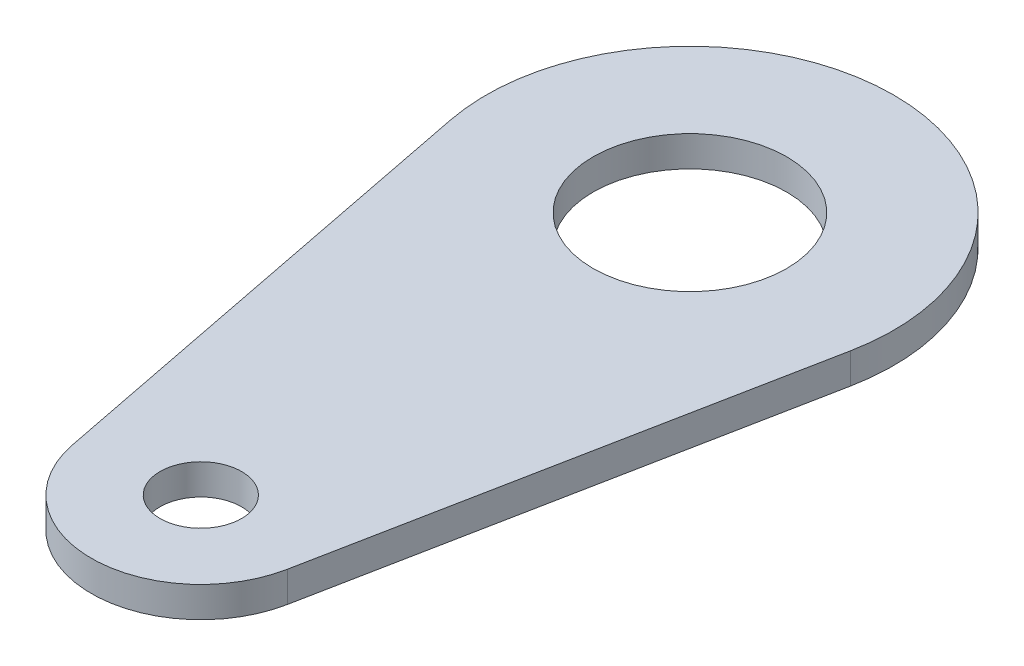
ISO-10303-21;
HEADER;
FILE_DESCRIPTION(('STEP AP214'),'2;1');
FILE_NAME('part.step','',(''),(''),'','','');
FILE_SCHEMA(('AUTOMOTIVE_DESIGN { 1 0 10303 214 1 1 1 1 }'));
ENDSEC;
DATA;
#1=APPLICATION_CONTEXT('core data for automotive mechanical design processes');
#2=APPLICATION_PROTOCOL_DEFINITION('international standard','automotive_design',2000,#1);
#3=PRODUCT_CONTEXT('',#1,'mechanical');
#4=PRODUCT('Part','Part','',(#3));
#5=PRODUCT_RELATED_PRODUCT_CATEGORY('part','',(#4));
#6=PRODUCT_DEFINITION_FORMATION('','',#4);
#7=PRODUCT_DEFINITION_CONTEXT('part definition',#1,'design');
#8=PRODUCT_DEFINITION('design','',#6,#7);
#9=PRODUCT_DEFINITION_SHAPE('','',#8);
#10=(LENGTH_UNIT() NAMED_UNIT(*) SI_UNIT(.MILLI.,.METRE.));
#11=(NAMED_UNIT(*) PLANE_ANGLE_UNIT() SI_UNIT($,.RADIAN.));
#12=(NAMED_UNIT(*) SI_UNIT($,.STERADIAN.) SOLID_ANGLE_UNIT());
#13=UNCERTAINTY_MEASURE_WITH_UNIT(LENGTH_MEASURE(1.E-05),#10,'distance_accuracy_value','');
#14=(GEOMETRIC_REPRESENTATION_CONTEXT(3) GLOBAL_UNCERTAINTY_ASSIGNED_CONTEXT((#13)) GLOBAL_UNIT_ASSIGNED_CONTEXT((#10,
#11,#12)) REPRESENTATION_CONTEXT('',''));
#15=CARTESIAN_POINT('',(0.,0.,0.));
#16=DIRECTION('',(0.,0.,1.));
#17=DIRECTION('',(1.,0.,0.));
#18=AXIS2_PLACEMENT_3D('',#15,#16,#17);
#19=CARTESIAN_POINT('',(-12564.1775071324,3.,2466.6206701445));
#20=DIRECTION('',(-0.981268649678853,0.,0.192644328121647));
#21=DIRECTION('',(0.192644328121647,0.,0.981268649678853));
#22=AXIS2_PLACEMENT_3D('',#19,#20,#21);
#23=PLANE('',#22);
#24=DIRECTION('',(-0.192644328121647,0.,-0.981268649678853));
#25=VECTOR('',#24,1.);
#26=CARTESIAN_POINT('',(-12564.1775071324,0.,2466.6206701445));
#27=LINE('',#26,#25);
#28=CARTESIAN_POINT('',(-13667.6303001794,0.,-3154.01525916134));
#29=VERTEX_POINT('',#28);
#30=CARTESIAN_POINT('',(-13676.7003205574,0.,-3200.21504472334));
#31=VERTEX_POINT('',#30);
#32=EDGE_CURVE('E108',#29,#31,#27,.T.);
#33=ORIENTED_EDGE('',*,*,#32,.F.);
#34=DIRECTION('',(0.,-1.,0.));
#35=VECTOR('',#34,1.);
#36=CARTESIAN_POINT('',(-13667.6303001794,3.,-3154.01525916134));
#37=LINE('',#36,#35);
#38=CARTESIAN_POINT('',(-13667.6303001794,3.,-3154.01525916134));
#39=VERTEX_POINT('',#38);
#40=EDGE_CURVE('E11',#39,#29,#37,.T.);
#41=ORIENTED_EDGE('',*,*,#40,.F.);
#42=DIRECTION('',(-0.192644328121647,0.,-0.981268649678853));
#43=VECTOR('',#42,1.);
#44=CARTESIAN_POINT('',(-12564.1775071324,3.,2466.6206701445));
#45=LINE('',#44,#43);
#46=CARTESIAN_POINT('',(-13676.7003205574,3.,-3200.21504472334));
#47=VERTEX_POINT('',#46);
#48=EDGE_CURVE('E93',#39,#47,#45,.T.);
#49=ORIENTED_EDGE('',*,*,#48,.T.);
#50=DIRECTION('',(0.,-1.,0.));
#51=VECTOR('',#50,1.);
#52=CARTESIAN_POINT('',(-13676.7003205574,3.,-3200.21504472334));
#53=LINE('',#52,#51);
#54=EDGE_CURVE('E75',#47,#31,#53,.T.);
#55=ORIENTED_EDGE('',*,*,#54,.T.);
#56=EDGE_LOOP('',(#33,#41,#49,#55));
#57=FACE_BOUND('',#56,.T.);
#58=ADVANCED_FACE('F35',(#57),#23,.T.);
#59=CARTESIAN_POINT('',(-13657.0749479782,3.,-3156.06793120444));
#60=DIRECTION('',(0.,-1.,0.));
#61=DIRECTION('',(0.,0.,-1.));
#62=AXIS2_PLACEMENT_3D('',#59,#60,#61);
#63=CYLINDRICAL_SURFACE('',#62,10.7530889798288);
#64=CARTESIAN_POINT('',(-13657.0749479782,0.,-3156.06793120444));
#65=DIRECTION('',(0.,1.,0.));
#66=DIRECTION('',(0.,0.,1.));
#67=AXIS2_PLACEMENT_3D('',#64,#65,#66);
#68=CIRCLE('',#67,10.7530889798288);
#69=CARTESIAN_POINT('',(-13646.519595777,0.,-3154.01525916117));
#70=VERTEX_POINT('',#69);
#71=EDGE_CURVE('E98',#29,#70,#68,.T.);
#72=ORIENTED_EDGE('',*,*,#71,.T.);
#73=DIRECTION('',(0.,-1.,0.));
#74=VECTOR('',#73,1.);
#75=CARTESIAN_POINT('',(-13646.519595777,3.,-3154.01525916117));
#76=LINE('',#75,#74);
#77=CARTESIAN_POINT('',(-13646.519595777,3.,-3154.01525916117));
#78=VERTEX_POINT('',#77);
#79=EDGE_CURVE('E45',#78,#70,#76,.T.);
#80=ORIENTED_EDGE('',*,*,#79,.F.);
#81=CARTESIAN_POINT('',(-13657.0749479782,3.,-3156.06793120444));
#82=DIRECTION('',(0.,1.,0.));
#83=DIRECTION('',(0.,0.,1.));
#84=AXIS2_PLACEMENT_3D('',#81,#82,#83);
#85=CIRCLE('',#84,10.7530889798288);
#86=EDGE_CURVE('E90',#39,#78,#85,.T.);
#87=ORIENTED_EDGE('',*,*,#86,.F.);
#88=ORIENTED_EDGE('',*,*,#40,.T.);
#89=EDGE_LOOP('',(#72,#80,#87,#88));
#90=FACE_BOUND('',#89,.T.);
#91=ADVANCED_FACE('F96',(#90),#63,.T.);
#92=CARTESIAN_POINT('',(-13736.2941057912,3.,-2696.73259179085));
#93=DIRECTION('',(-0.981268649678852,0.,-0.192644328121652));
#94=DIRECTION('',(-0.192644328121652,0.,0.981268649678852));
#95=AXIS2_PLACEMENT_3D('',#92,#93,#94);
#96=PLANE('',#95);
#97=DIRECTION('',(0.192644328121652,0.,-0.981268649678852));
#98=VECTOR('',#97,1.);
#99=CARTESIAN_POINT('',(-13736.2941057912,0.,-2696.73259179085));
#100=LINE('',#99,#98);
#101=CARTESIAN_POINT('',(-13637.4495753989,0.,-3200.21504472334));
#102=VERTEX_POINT('',#101);
#103=EDGE_CURVE('E105',#70,#102,#100,.T.);
#104=ORIENTED_EDGE('',*,*,#103,.T.);
#105=DIRECTION('',(0.,-1.,0.));
#106=VECTOR('',#105,1.);
#107=CARTESIAN_POINT('',(-13637.4495753989,3.,-3200.21504472334));
#108=LINE('',#107,#106);
#109=CARTESIAN_POINT('',(-13637.4495753989,3.,-3200.21504472334));
#110=VERTEX_POINT('',#109);
#111=EDGE_CURVE('E89',#110,#102,#108,.T.);
#112=ORIENTED_EDGE('',*,*,#111,.F.);
#113=DIRECTION('',(0.192644328121652,0.,-0.981268649678852));
#114=VECTOR('',#113,1.);
#115=CARTESIAN_POINT('',(-13736.2941057912,3.,-2696.73259179085));
#116=LINE('',#115,#114);
#117=EDGE_CURVE('E83',#78,#110,#116,.T.);
#118=ORIENTED_EDGE('',*,*,#117,.F.);
#119=ORIENTED_EDGE('',*,*,#79,.T.);
#120=EDGE_LOOP('',(#104,#112,#118,#119));
#121=FACE_BOUND('',#120,.T.);
#122=ADVANCED_FACE('F86',(#121),#96,.F.);
#123=CARTESIAN_POINT('',(-13657.0749479782,3.,-3156.06793120444));
#124=DIRECTION('',(0.,-1.,0.));
#125=DIRECTION('',(0.,0.,-1.));
#126=AXIS2_PLACEMENT_3D('',#123,#124,#125);
#127=CYLINDRICAL_SURFACE('',#126,3.99999991556044);
#128=CARTESIAN_POINT('',(-13657.0749479782,3.,-3156.06793120444));
#129=DIRECTION('',(0.,1.,0.));
#130=DIRECTION('',(0.,0.,1.));
#131=AXIS2_PLACEMENT_3D('',#128,#129,#130);
#132=CIRCLE('',#131,3.99999991556044);
#133=CARTESIAN_POINT('',(-13657.0749479782,3.,-3152.06793128888));
#134=VERTEX_POINT('',#133);
#135=EDGE_CURVE('E104',#134,#134,#132,.T.);
#136=ORIENTED_EDGE('',*,*,#135,.T.);
#137=EDGE_LOOP('',(#136));
#138=FACE_BOUND('',#137,.T.);
#139=CARTESIAN_POINT('',(-13657.0749479782,0.,-3156.06793120444));
#140=DIRECTION('',(0.,1.,0.));
#141=DIRECTION('',(0.,0.,1.));
#142=AXIS2_PLACEMENT_3D('',#139,#140,#141);
#143=CIRCLE('',#142,3.99999991556044);
#144=CARTESIAN_POINT('',(-13657.0749479782,0.,-3152.06793128888));
#145=VERTEX_POINT('',#144);
#146=EDGE_CURVE('E110',#145,#145,#143,.T.);
#147=ORIENTED_EDGE('',*,*,#146,.F.);
#148=EDGE_LOOP('',(#147));
#149=FACE_BOUND('',#148,.T.);
#150=ADVANCED_FACE('F37',(#138,#149),#127,.F.);
#151=CARTESIAN_POINT('',(-13657.0749479782,3.,-3204.06793120444));
#152=DIRECTION('',(0.,-1.,0.));
#153=DIRECTION('',(0.,0.,-1.));
#154=AXIS2_PLACEMENT_3D('',#151,#152,#153);
#155=CYLINDRICAL_SURFACE('',#154,19.9999995778026);
#156=CARTESIAN_POINT('',(-13657.0749479782,0.,-3204.06793120444));
#157=DIRECTION('',(0.,1.,0.));
#158=DIRECTION('',(0.,0.,1.));
#159=AXIS2_PLACEMENT_3D('',#156,#157,#158);
#160=CIRCLE('',#159,19.9999995778026);
#161=EDGE_CURVE('E68',#102,#31,#160,.T.);
#162=ORIENTED_EDGE('',*,*,#161,.T.);
#163=ORIENTED_EDGE('',*,*,#54,.F.);
#164=CARTESIAN_POINT('',(-13657.0749479782,3.,-3204.06793120444));
#165=DIRECTION('',(0.,1.,0.));
#166=DIRECTION('',(0.,0.,1.));
#167=AXIS2_PLACEMENT_3D('',#164,#165,#166);
#168=CIRCLE('',#167,19.9999995778026);
#169=EDGE_CURVE('E53',#110,#47,#168,.T.);
#170=ORIENTED_EDGE('',*,*,#169,.F.);
#171=ORIENTED_EDGE('',*,*,#111,.T.);
#172=EDGE_LOOP('',(#162,#163,#170,#171));
#173=FACE_BOUND('',#172,.T.);
#174=ADVANCED_FACE('F144',(#173),#155,.T.);
#175=CARTESIAN_POINT('',(0.,3.,0.));
#176=DIRECTION('',(0.,1.,0.));
#177=DIRECTION('',(0.,0.,1.));
#178=AXIS2_PLACEMENT_3D('',#175,#176,#177);
#179=PLANE('',#178);
#180=CARTESIAN_POINT('',(-13657.0749335795,3.,-3204.06791633806));
#181=DIRECTION('',(0.,-1.,0.));
#182=DIRECTION('',(0.,0.,-1.));
#183=AXIS2_PLACEMENT_3D('',#180,#181,#182);
#184=CIRCLE('',#183,9.49999999999876);
#185=CARTESIAN_POINT('',(-13657.0749335795,3.,-3213.56791633806));
#186=VERTEX_POINT('',#185);
#187=EDGE_CURVE('E117',#186,#186,#184,.T.);
#188=ORIENTED_EDGE('',*,*,#187,.T.);
#189=EDGE_LOOP('',(#188));
#190=FACE_BOUND('',#189,.T.);
#191=ORIENTED_EDGE('',*,*,#135,.F.);
#192=EDGE_LOOP('',(#191));
#193=FACE_BOUND('',#192,.T.);
#194=ORIENTED_EDGE('',*,*,#48,.F.);
#195=ORIENTED_EDGE('',*,*,#86,.T.);
#196=ORIENTED_EDGE('',*,*,#117,.T.);
#197=ORIENTED_EDGE('',*,*,#169,.T.);
#198=EDGE_LOOP('',(#194,#195,#196,#197));
#199=FACE_BOUND('',#198,.T.);
#200=ADVANCED_FACE('F92',(#190,#193,#199),#179,.T.);
#201=CARTESIAN_POINT('',(0.,0.,0.));
#202=DIRECTION('',(0.,1.,0.));
#203=DIRECTION('',(0.,0.,1.));
#204=AXIS2_PLACEMENT_3D('',#201,#202,#203);
#205=PLANE('',#204);
#206=CARTESIAN_POINT('',(-13657.0749335795,0.,-3204.06791633806));
#207=DIRECTION('',(0.,1.,0.));
#208=DIRECTION('',(0.,0.,1.));
#209=AXIS2_PLACEMENT_3D('',#206,#207,#208);
#210=CIRCLE('',#209,9.49999999999876);
#211=CARTESIAN_POINT('',(-13657.0749335795,0.,-3194.56791633806));
#212=VERTEX_POINT('',#211);
#213=EDGE_CURVE('E39',#212,#212,#210,.T.);
#214=ORIENTED_EDGE('',*,*,#213,.T.);
#215=EDGE_LOOP('',(#214));
#216=FACE_BOUND('',#215,.T.);
#217=ORIENTED_EDGE('',*,*,#146,.T.);
#218=EDGE_LOOP('',(#217));
#219=FACE_BOUND('',#218,.T.);
#220=ORIENTED_EDGE('',*,*,#32,.T.);
#221=ORIENTED_EDGE('',*,*,#161,.F.);
#222=ORIENTED_EDGE('',*,*,#103,.F.);
#223=ORIENTED_EDGE('',*,*,#71,.F.);
#224=EDGE_LOOP('',(#220,#221,#222,#223));
#225=FACE_BOUND('',#224,.T.);
#226=ADVANCED_FACE('F124',(#216,#219,#225),#205,.F.);
#227=CARTESIAN_POINT('',(-13657.0749335795,3.,-3204.06791633806));
#228=DIRECTION('',(0.,-1.,0.));
#229=DIRECTION('',(0.,0.,-1.));
#230=AXIS2_PLACEMENT_3D('',#227,#228,#229);
#231=CYLINDRICAL_SURFACE('',#230,9.49999999999876);
#232=ORIENTED_EDGE('',*,*,#187,.F.);
#233=EDGE_LOOP('',(#232));
#234=FACE_BOUND('',#233,.T.);
#235=ORIENTED_EDGE('',*,*,#213,.F.);
#236=EDGE_LOOP('',(#235));
#237=FACE_BOUND('',#236,.T.);
#238=ADVANCED_FACE('F127',(#234,#237),#231,.F.);
#239=CLOSED_SHELL('',(#58,#91,#122,#150,#174,#200,#226,#238));
#240=MANIFOLD_SOLID_BREP('B2',#239);
#241=ADVANCED_BREP_SHAPE_REPRESENTATION('',(#18,#240),#14);
#242=SHAPE_DEFINITION_REPRESENTATION(#9,#241);
ENDSEC;
END-ISO-10303-21;
